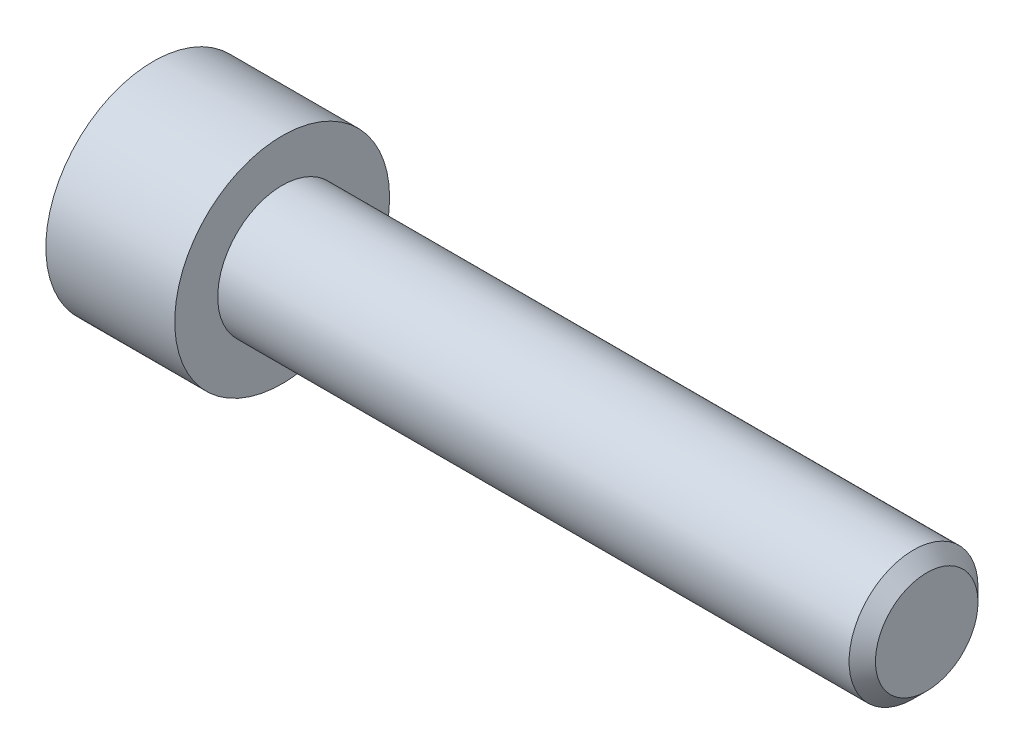
ISO-10303-21;
HEADER;
FILE_DESCRIPTION(('STEP AP214'),'2;1');
FILE_NAME('part.step','',(''),(''),'','','');
FILE_SCHEMA(('AUTOMOTIVE_DESIGN { 1 0 10303 214 1 1 1 1 }'));
ENDSEC;
DATA;
#1=APPLICATION_CONTEXT('core data for automotive mechanical design processes');
#2=APPLICATION_PROTOCOL_DEFINITION('international standard','automotive_design',2000,#1);
#3=PRODUCT_CONTEXT('',#1,'mechanical');
#4=PRODUCT('Part','Part','',(#3));
#5=PRODUCT_RELATED_PRODUCT_CATEGORY('part','',(#4));
#6=PRODUCT_DEFINITION_FORMATION('','',#4);
#7=PRODUCT_DEFINITION_CONTEXT('part definition',#1,'design');
#8=PRODUCT_DEFINITION('design','',#6,#7);
#9=PRODUCT_DEFINITION_SHAPE('','',#8);
#10=(LENGTH_UNIT() NAMED_UNIT(*) SI_UNIT(.MILLI.,.METRE.));
#11=(NAMED_UNIT(*) PLANE_ANGLE_UNIT() SI_UNIT($,.RADIAN.));
#12=(NAMED_UNIT(*) SI_UNIT($,.STERADIAN.) SOLID_ANGLE_UNIT());
#13=UNCERTAINTY_MEASURE_WITH_UNIT(LENGTH_MEASURE(1.E-05),#10,'distance_accuracy_value','');
#14=(GEOMETRIC_REPRESENTATION_CONTEXT(3) GLOBAL_UNCERTAINTY_ASSIGNED_CONTEXT((#13)) GLOBAL_UNIT_ASSIGNED_CONTEXT((#10,
#11,#12)) REPRESENTATION_CONTEXT('',''));
#15=CARTESIAN_POINT('',(0.,0.,0.));
#16=DIRECTION('',(0.,0.,1.));
#17=DIRECTION('',(1.,0.,0.));
#18=AXIS2_PLACEMENT_3D('',#15,#16,#17);
#19=CARTESIAN_POINT('',(30.,0.,0.));
#20=DIRECTION('',(-1.,0.,0.));
#21=DIRECTION('',(0.,0.,-1.));
#22=AXIS2_PLACEMENT_3D('',#19,#20,#21);
#23=CYLINDRICAL_SURFACE('',#22,5.);
#24=CARTESIAN_POINT('',(-6.,0.,0.));
#25=DIRECTION('',(1.,0.,0.));
#26=DIRECTION('',(0.,0.,-1.));
#27=AXIS2_PLACEMENT_3D('',#24,#25,#26);
#28=CIRCLE('',#27,5.);
#29=CARTESIAN_POINT('',(-6.,0.,-5.));
#30=VERTEX_POINT('',#29);
#31=EDGE_CURVE('E11',#30,#30,#28,.T.);
#32=ORIENTED_EDGE('',*,*,#31,.T.);
#33=EDGE_LOOP('',(#32));
#34=FACE_BOUND('',#33,.T.);
#35=CARTESIAN_POINT('',(0.,0.,0.));
#36=DIRECTION('',(1.,0.,0.));
#37=DIRECTION('',(0.,0.,-1.));
#38=AXIS2_PLACEMENT_3D('',#35,#36,#37);
#39=CIRCLE('',#38,5.);
#40=CARTESIAN_POINT('',(0.,0.,-5.));
#41=VERTEX_POINT('',#40);
#42=EDGE_CURVE('E167',#41,#41,#39,.T.);
#43=ORIENTED_EDGE('',*,*,#42,.F.);
#44=EDGE_LOOP('',(#43));
#45=FACE_BOUND('',#44,.T.);
#46=ADVANCED_FACE('F16',(#34,#45),#23,.T.);
#47=CARTESIAN_POINT('',(-6.,0.,0.));
#48=DIRECTION('',(1.,0.,0.));
#49=DIRECTION('',(0.,1.,0.));
#50=AXIS2_PLACEMENT_3D('',#47,#48,#49);
#51=PLANE('',#50);
#52=ORIENTED_EDGE('',*,*,#31,.F.);
#53=EDGE_LOOP('',(#52));
#54=FACE_BOUND('',#53,.T.);
#55=DIRECTION('',(0.,-1.,0.));
#56=VECTOR('',#55,1.);
#57=CARTESIAN_POINT('',(-6.,1.44337567297406,2.5));
#58=LINE('',#57,#56);
#59=CARTESIAN_POINT('',(-6.,1.44337567297406,2.5));
#60=VERTEX_POINT('',#59);
#61=CARTESIAN_POINT('',(-6.,-1.44337567297406,2.5));
#62=VERTEX_POINT('',#61);
#63=EDGE_CURVE('E27',#60,#62,#58,.T.);
#64=ORIENTED_EDGE('',*,*,#63,.T.);
#65=DIRECTION('',(0.,-0.5,-0.866025403784439));
#66=VECTOR('',#65,1.);
#67=CARTESIAN_POINT('',(-6.,-1.44337567297406,2.5));
#68=LINE('',#67,#66);
#69=CARTESIAN_POINT('',(-6.,-2.88675134594813,0.));
#70=VERTEX_POINT('',#69);
#71=EDGE_CURVE('E193',#62,#70,#68,.T.);
#72=ORIENTED_EDGE('',*,*,#71,.T.);
#73=DIRECTION('',(0.,0.5,-0.866025403784439));
#74=VECTOR('',#73,1.);
#75=CARTESIAN_POINT('',(-6.,-2.88675134594813,0.));
#76=LINE('',#75,#74);
#77=CARTESIAN_POINT('',(-6.,-1.44337567297406,-2.5));
#78=VERTEX_POINT('',#77);
#79=EDGE_CURVE('E117',#70,#78,#76,.T.);
#80=ORIENTED_EDGE('',*,*,#79,.T.);
#81=DIRECTION('',(0.,1.,0.));
#82=VECTOR('',#81,1.);
#83=CARTESIAN_POINT('',(-6.,-1.44337567297406,-2.5));
#84=LINE('',#83,#82);
#85=CARTESIAN_POINT('',(-6.,1.44337567297406,-2.5));
#86=VERTEX_POINT('',#85);
#87=EDGE_CURVE('E154',#78,#86,#84,.T.);
#88=ORIENTED_EDGE('',*,*,#87,.T.);
#89=DIRECTION('',(0.,0.5,0.866025403784439));
#90=VECTOR('',#89,1.);
#91=CARTESIAN_POINT('',(-6.,1.44337567297406,-2.5));
#92=LINE('',#91,#90);
#93=CARTESIAN_POINT('',(-6.,2.88675134594813,0.));
#94=VERTEX_POINT('',#93);
#95=EDGE_CURVE('E150',#86,#94,#92,.T.);
#96=ORIENTED_EDGE('',*,*,#95,.T.);
#97=DIRECTION('',(0.,-0.5,0.866025403784439));
#98=VECTOR('',#97,1.);
#99=CARTESIAN_POINT('',(-6.,2.88675134594813,0.));
#100=LINE('',#99,#98);
#101=EDGE_CURVE('E131',#94,#60,#100,.T.);
#102=ORIENTED_EDGE('',*,*,#101,.T.);
#103=EDGE_LOOP('',(#64,#72,#80,#88,#96,#102));
#104=FACE_BOUND('',#103,.T.);
#105=ADVANCED_FACE('F227',(#54,#104),#51,.F.);
#106=CARTESIAN_POINT('',(-3.,-1.44337567297406,2.5));
#107=DIRECTION('',(0.,0.866025403784439,-0.5));
#108=DIRECTION('',(-1.,0.,0.));
#109=AXIS2_PLACEMENT_3D('',#106,#107,#108);
#110=PLANE('',#109);
#111=ORIENTED_EDGE('',*,*,#71,.F.);
#112=DIRECTION('',(-1.,0.,0.));
#113=VECTOR('',#112,1.);
#114=CARTESIAN_POINT('',(-3.,-1.44337567297406,2.5));
#115=LINE('',#114,#113);
#116=CARTESIAN_POINT('',(-3.,-1.44337567297406,2.5));
#117=VERTEX_POINT('',#116);
#118=EDGE_CURVE('E126',#117,#62,#115,.T.);
#119=ORIENTED_EDGE('',*,*,#118,.F.);
#120=DIRECTION('',(0.,-0.5,-0.866025403784439));
#121=VECTOR('',#120,1.);
#122=CARTESIAN_POINT('',(-3.,-1.44337567297406,2.5));
#123=LINE('',#122,#121);
#124=CARTESIAN_POINT('',(-3.,-2.88675134594813,0.));
#125=VERTEX_POINT('',#124);
#126=EDGE_CURVE('E121',#117,#125,#123,.T.);
#127=ORIENTED_EDGE('',*,*,#126,.T.);
#128=DIRECTION('',(-1.,0.,0.));
#129=VECTOR('',#128,1.);
#130=CARTESIAN_POINT('',(-3.,-2.88675134594813,0.));
#131=LINE('',#130,#129);
#132=EDGE_CURVE('E109',#125,#70,#131,.T.);
#133=ORIENTED_EDGE('',*,*,#132,.T.);
#134=EDGE_LOOP('',(#111,#119,#127,#133));
#135=FACE_BOUND('',#134,.T.);
#136=ADVANCED_FACE('F124',(#135),#110,.T.);
#137=CARTESIAN_POINT('',(-3.,-2.88675134594813,0.));
#138=DIRECTION('',(0.,0.866025403784439,0.5));
#139=DIRECTION('',(1.,0.,0.));
#140=AXIS2_PLACEMENT_3D('',#137,#138,#139);
#141=PLANE('',#140);
#142=ORIENTED_EDGE('',*,*,#79,.F.);
#143=ORIENTED_EDGE('',*,*,#132,.F.);
#144=DIRECTION('',(0.,0.5,-0.866025403784439));
#145=VECTOR('',#144,1.);
#146=CARTESIAN_POINT('',(-3.,-2.88675134594813,0.));
#147=LINE('',#146,#145);
#148=CARTESIAN_POINT('',(-3.,-1.44337567297406,-2.5));
#149=VERTEX_POINT('',#148);
#150=EDGE_CURVE('E114',#125,#149,#147,.T.);
#151=ORIENTED_EDGE('',*,*,#150,.T.);
#152=DIRECTION('',(-1.,0.,0.));
#153=VECTOR('',#152,1.);
#154=CARTESIAN_POINT('',(-3.,-1.44337567297406,-2.5));
#155=LINE('',#154,#153);
#156=EDGE_CURVE('E139',#149,#78,#155,.T.);
#157=ORIENTED_EDGE('',*,*,#156,.T.);
#158=EDGE_LOOP('',(#142,#143,#151,#157));
#159=FACE_BOUND('',#158,.T.);
#160=ADVANCED_FACE('F111',(#159),#141,.T.);
#161=CARTESIAN_POINT('',(-3.,1.44337567297406,2.5));
#162=DIRECTION('',(0.,0.,-1.));
#163=DIRECTION('',(0.,-1.,0.));
#164=AXIS2_PLACEMENT_3D('',#161,#162,#163);
#165=PLANE('',#164);
#166=ORIENTED_EDGE('',*,*,#63,.F.);
#167=DIRECTION('',(-1.,0.,0.));
#168=VECTOR('',#167,1.);
#169=CARTESIAN_POINT('',(-3.,1.44337567297406,2.5));
#170=LINE('',#169,#168);
#171=CARTESIAN_POINT('',(-3.,1.44337567297406,2.5));
#172=VERTEX_POINT('',#171);
#173=EDGE_CURVE('E149',#172,#60,#170,.T.);
#174=ORIENTED_EDGE('',*,*,#173,.F.);
#175=DIRECTION('',(0.,-1.,0.));
#176=VECTOR('',#175,1.);
#177=CARTESIAN_POINT('',(-3.,1.44337567297406,2.5));
#178=LINE('',#177,#176);
#179=EDGE_CURVE('E20',#172,#117,#178,.T.);
#180=ORIENTED_EDGE('',*,*,#179,.T.);
#181=ORIENTED_EDGE('',*,*,#118,.T.);
#182=EDGE_LOOP('',(#166,#174,#180,#181));
#183=FACE_BOUND('',#182,.T.);
#184=ADVANCED_FACE('F243',(#183),#165,.T.);
#185=CARTESIAN_POINT('',(30.,2.3865,0.));
#186=DIRECTION('',(-1.,0.,0.));
#187=DIRECTION('',(0.,0.,1.));
#188=AXIS2_PLACEMENT_3D('',#185,#186,#187);
#189=PLANE('',#188);
#190=CARTESIAN_POINT('',(30.,0.,0.));
#191=DIRECTION('',(1.,0.,0.));
#192=DIRECTION('',(0.,0.,-1.));
#193=AXIS2_PLACEMENT_3D('',#190,#191,#192);
#194=CIRCLE('',#193,2.3865);
#195=CARTESIAN_POINT('',(30.,0.,-2.3865));
#196=VERTEX_POINT('',#195);
#197=EDGE_CURVE('E155',#196,#196,#194,.T.);
#198=ORIENTED_EDGE('',*,*,#197,.T.);
#199=EDGE_LOOP('',(#198));
#200=FACE_BOUND('',#199,.T.);
#201=ADVANCED_FACE('F248',(#200),#189,.F.);
#202=CARTESIAN_POINT('',(29.3865,0.,0.));
#203=DIRECTION('',(-1.,0.,0.));
#204=DIRECTION('',(0.,0.,1.));
#205=AXIS2_PLACEMENT_3D('',#202,#203,#204);
#206=CONICAL_SURFACE('',#205,3.,0.785398163397449);
#207=CARTESIAN_POINT('',(29.3865,0.,0.));
#208=DIRECTION('',(1.,0.,0.));
#209=DIRECTION('',(0.,0.,-1.));
#210=AXIS2_PLACEMENT_3D('',#207,#208,#209);
#211=CIRCLE('',#210,3.);
#212=CARTESIAN_POINT('',(29.3865,0.,-3.));
#213=VERTEX_POINT('',#212);
#214=EDGE_CURVE('E159',#213,#213,#211,.T.);
#215=ORIENTED_EDGE('',*,*,#214,.T.);
#216=EDGE_LOOP('',(#215));
#217=FACE_BOUND('',#216,.T.);
#218=ORIENTED_EDGE('',*,*,#197,.F.);
#219=EDGE_LOOP('',(#218));
#220=FACE_BOUND('',#219,.T.);
#221=ADVANCED_FACE('F222',(#217,#220),#206,.T.);
#222=CARTESIAN_POINT('',(30.,0.,0.));
#223=DIRECTION('',(-1.,0.,0.));
#224=DIRECTION('',(0.,0.,-1.));
#225=AXIS2_PLACEMENT_3D('',#222,#223,#224);
#226=CYLINDRICAL_SURFACE('',#225,3.);
#227=CARTESIAN_POINT('',(0.,0.,0.));
#228=DIRECTION('',(1.,0.,0.));
#229=DIRECTION('',(0.,0.,-1.));
#230=AXIS2_PLACEMENT_3D('',#227,#228,#229);
#231=CIRCLE('',#230,3.);
#232=CARTESIAN_POINT('',(0.,0.,-3.));
#233=VERTEX_POINT('',#232);
#234=EDGE_CURVE('E163',#233,#233,#231,.T.);
#235=ORIENTED_EDGE('',*,*,#234,.T.);
#236=EDGE_LOOP('',(#235));
#237=FACE_BOUND('',#236,.T.);
#238=ORIENTED_EDGE('',*,*,#214,.F.);
#239=EDGE_LOOP('',(#238));
#240=FACE_BOUND('',#239,.T.);
#241=ADVANCED_FACE('F208',(#237,#240),#226,.T.);
#242=CARTESIAN_POINT('',(0.,5.,0.));
#243=DIRECTION('',(-1.,0.,0.));
#244=DIRECTION('',(0.,0.,1.));
#245=AXIS2_PLACEMENT_3D('',#242,#243,#244);
#246=PLANE('',#245);
#247=ORIENTED_EDGE('',*,*,#42,.T.);
#248=EDGE_LOOP('',(#247));
#249=FACE_BOUND('',#248,.T.);
#250=ORIENTED_EDGE('',*,*,#234,.F.);
#251=EDGE_LOOP('',(#250));
#252=FACE_BOUND('',#251,.T.);
#253=ADVANCED_FACE('F211',(#249,#252),#246,.F.);
#254=CARTESIAN_POINT('',(-3.,-1.44337567297406,-2.5));
#255=DIRECTION('',(0.,0.,1.));
#256=DIRECTION('',(1.,0.,0.));
#257=AXIS2_PLACEMENT_3D('',#254,#255,#256);
#258=PLANE('',#257);
#259=ORIENTED_EDGE('',*,*,#87,.F.);
#260=ORIENTED_EDGE('',*,*,#156,.F.);
#261=DIRECTION('',(0.,1.,0.));
#262=VECTOR('',#261,1.);
#263=CARTESIAN_POINT('',(-3.,-1.44337567297406,-2.5));
#264=LINE('',#263,#262);
#265=CARTESIAN_POINT('',(-3.,1.44337567297406,-2.5));
#266=VERTEX_POINT('',#265);
#267=EDGE_CURVE('E137',#149,#266,#264,.T.);
#268=ORIENTED_EDGE('',*,*,#267,.T.);
#269=DIRECTION('',(-1.,0.,0.));
#270=VECTOR('',#269,1.);
#271=CARTESIAN_POINT('',(-3.,1.44337567297406,-2.5));
#272=LINE('',#271,#270);
#273=EDGE_CURVE('E178',#266,#86,#272,.T.);
#274=ORIENTED_EDGE('',*,*,#273,.T.);
#275=EDGE_LOOP('',(#259,#260,#268,#274));
#276=FACE_BOUND('',#275,.T.);
#277=ADVANCED_FACE('F18',(#276),#258,.T.);
#278=CARTESIAN_POINT('',(-3.,1.44337567297406,-2.5));
#279=DIRECTION('',(0.,-0.866025403784439,0.5));
#280=DIRECTION('',(-1.,0.,0.));
#281=AXIS2_PLACEMENT_3D('',#278,#279,#280);
#282=PLANE('',#281);
#283=ORIENTED_EDGE('',*,*,#95,.F.);
#284=ORIENTED_EDGE('',*,*,#273,.F.);
#285=DIRECTION('',(0.,0.5,0.866025403784439));
#286=VECTOR('',#285,1.);
#287=CARTESIAN_POINT('',(-3.,1.44337567297406,-2.5));
#288=LINE('',#287,#286);
#289=CARTESIAN_POINT('',(-3.,2.88675134594813,0.));
#290=VERTEX_POINT('',#289);
#291=EDGE_CURVE('E186',#266,#290,#288,.T.);
#292=ORIENTED_EDGE('',*,*,#291,.T.);
#293=DIRECTION('',(-1.,0.,0.));
#294=VECTOR('',#293,1.);
#295=CARTESIAN_POINT('',(-3.,2.88675134594813,0.));
#296=LINE('',#295,#294);
#297=EDGE_CURVE('E175',#290,#94,#296,.T.);
#298=ORIENTED_EDGE('',*,*,#297,.T.);
#299=EDGE_LOOP('',(#283,#284,#292,#298));
#300=FACE_BOUND('',#299,.T.);
#301=ADVANCED_FACE('F220',(#300),#282,.T.);
#302=CARTESIAN_POINT('',(-3.,2.88675134594813,0.));
#303=DIRECTION('',(0.,-0.866025403784439,-0.5));
#304=DIRECTION('',(0.,0.5,-0.866025403784439));
#305=AXIS2_PLACEMENT_3D('',#302,#303,#304);
#306=PLANE('',#305);
#307=ORIENTED_EDGE('',*,*,#101,.F.);
#308=ORIENTED_EDGE('',*,*,#297,.F.);
#309=DIRECTION('',(0.,-0.5,0.866025403784439));
#310=VECTOR('',#309,1.);
#311=CARTESIAN_POINT('',(-3.,2.88675134594813,0.));
#312=LINE('',#311,#310);
#313=EDGE_CURVE('E171',#290,#172,#312,.T.);
#314=ORIENTED_EDGE('',*,*,#313,.T.);
#315=ORIENTED_EDGE('',*,*,#173,.T.);
#316=EDGE_LOOP('',(#307,#308,#314,#315));
#317=FACE_BOUND('',#316,.T.);
#318=ADVANCED_FACE('F236',(#317),#306,.T.);
#319=CARTESIAN_POINT('',(-3.,0.,0.));
#320=DIRECTION('',(1.,0.,0.));
#321=DIRECTION('',(0.,1.,0.));
#322=AXIS2_PLACEMENT_3D('',#319,#320,#321);
#323=PLANE('',#322);
#324=ORIENTED_EDGE('',*,*,#179,.F.);
#325=ORIENTED_EDGE('',*,*,#313,.F.);
#326=ORIENTED_EDGE('',*,*,#291,.F.);
#327=ORIENTED_EDGE('',*,*,#267,.F.);
#328=ORIENTED_EDGE('',*,*,#150,.F.);
#329=ORIENTED_EDGE('',*,*,#126,.F.);
#330=EDGE_LOOP('',(#324,#325,#326,#327,#328,#329));
#331=FACE_BOUND('',#330,.T.);
#332=CARTESIAN_POINT('',(-3.,0.,0.));
#333=DIRECTION('',(1.,0.,0.));
#334=DIRECTION('',(0.,0.,-1.));
#335=AXIS2_PLACEMENT_3D('',#332,#333,#334);
#336=CIRCLE('',#335,2.49);
#337=CARTESIAN_POINT('',(-3.,0.,-2.49));
#338=VERTEX_POINT('',#337);
#339=EDGE_CURVE('E145',#338,#338,#336,.T.);
#340=ORIENTED_EDGE('',*,*,#339,.T.);
#341=EDGE_LOOP('',(#340));
#342=FACE_BOUND('',#341,.T.);
#343=ADVANCED_FACE('F133',(#331,#342),#323,.F.);
#344=CARTESIAN_POINT('',(-3.,0.,0.));
#345=DIRECTION('',(-1.,0.,0.));
#346=DIRECTION('',(0.,0.,1.));
#347=AXIS2_PLACEMENT_3D('',#344,#345,#346);
#348=CONICAL_SURFACE('',#347,2.49,1.0471975511966);
#349=ORIENTED_EDGE('',*,*,#339,.F.);
#350=EDGE_LOOP('',(#349));
#351=FACE_BOUND('',#350,.T.);
#352=CARTESIAN_POINT('',(-1.56239782971783,0.,0.));
#353=VERTEX_POINT('',#352);
#354=VERTEX_LOOP('',#353);
#355=FACE_BOUND('',#354,.T.);
#356=ADVANCED_FACE('F262',(#351,#355),#348,.F.);
#357=CLOSED_SHELL('',(#46,#105,#136,#160,#184,#201,#221,#241,#253,#277,#301,#318,#343,#356));
#358=MANIFOLD_SOLID_BREP('B1',#357);
#359=ADVANCED_BREP_SHAPE_REPRESENTATION('',(#18,#358),#14);
#360=SHAPE_DEFINITION_REPRESENTATION(#9,#359);
ENDSEC;
END-ISO-10303-21;
